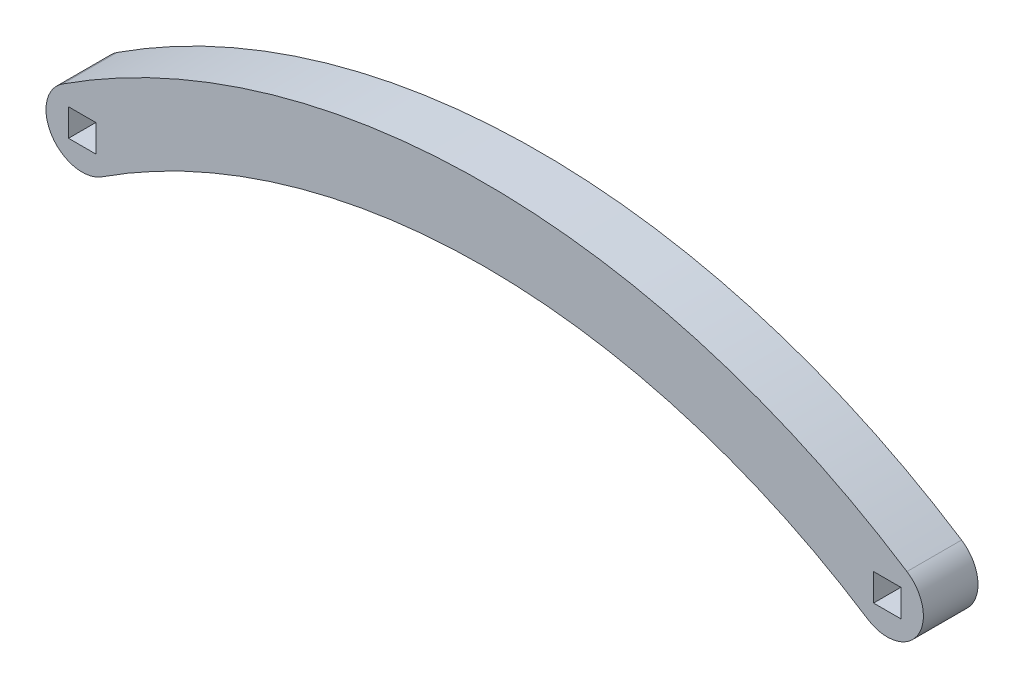
ISO-10303-21;
HEADER;
FILE_DESCRIPTION(('STEP AP214'),'2;1');
FILE_NAME('part.step','',(''),(''),'','','');
FILE_SCHEMA(('AUTOMOTIVE_DESIGN { 1 0 10303 214 1 1 1 1 }'));
ENDSEC;
DATA;
#1=APPLICATION_CONTEXT('core data for automotive mechanical design processes');
#2=APPLICATION_PROTOCOL_DEFINITION('international standard','automotive_design',2000,#1);
#3=PRODUCT_CONTEXT('',#1,'mechanical');
#4=PRODUCT('Part','Part','',(#3));
#5=PRODUCT_RELATED_PRODUCT_CATEGORY('part','',(#4));
#6=PRODUCT_DEFINITION_FORMATION('','',#4);
#7=PRODUCT_DEFINITION_CONTEXT('part definition',#1,'design');
#8=PRODUCT_DEFINITION('design','',#6,#7);
#9=PRODUCT_DEFINITION_SHAPE('','',#8);
#10=(LENGTH_UNIT() NAMED_UNIT(*) SI_UNIT(.MILLI.,.METRE.));
#11=(NAMED_UNIT(*) PLANE_ANGLE_UNIT() SI_UNIT($,.RADIAN.));
#12=(NAMED_UNIT(*) SI_UNIT($,.STERADIAN.) SOLID_ANGLE_UNIT());
#13=UNCERTAINTY_MEASURE_WITH_UNIT(LENGTH_MEASURE(1.E-05),#10,'distance_accuracy_value','');
#14=(GEOMETRIC_REPRESENTATION_CONTEXT(3) GLOBAL_UNCERTAINTY_ASSIGNED_CONTEXT((#13)) GLOBAL_UNIT_ASSIGNED_CONTEXT((#10,
#11,#12)) REPRESENTATION_CONTEXT('',''));
#15=CARTESIAN_POINT('',(0.,0.,0.));
#16=DIRECTION('',(0.,0.,1.));
#17=DIRECTION('',(1.,0.,0.));
#18=AXIS2_PLACEMENT_3D('',#15,#16,#17);
#19=CARTESIAN_POINT('',(70.19925,-35.952738452007,6.35));
#20=DIRECTION('',(0.,0.,1.));
#21=DIRECTION('',(1.,0.,0.));
#22=AXIS2_PLACEMENT_3D('',#19,#20,#21);
#23=PLANE('',#22);
#24=CARTESIAN_POINT('',(93.599,0.,6.35));
#25=DIRECTION('',(0.,0.,1.));
#26=DIRECTION('',(1.,0.,0.));
#27=AXIS2_PLACEMENT_3D('',#24,#25,#26);
#28=CIRCLE('',#27,4.20759868162931);
#29=CARTESIAN_POINT('',(91.3038071306281,-3.52646797206967,6.35));
#30=VERTEX_POINT('',#29);
#31=CARTESIAN_POINT('',(95.8941928693718,3.52646797206971,6.35));
#32=VERTEX_POINT('',#31);
#33=EDGE_CURVE('E220',#30,#32,#28,.T.);
#34=ORIENTED_EDGE('',*,*,#33,.T.);
#35=CARTESIAN_POINT('',(46.7995,-71.905476904014,6.35));
#36=DIRECTION('',(0.,0.,1.));
#37=DIRECTION('',(1.,0.,0.));
#38=AXIS2_PLACEMENT_3D('',#35,#36,#37);
#39=CIRCLE('',#38,90.0014842973519);
#40=CARTESIAN_POINT('',(-2.29519286937187,3.52646797206969,6.35));
#41=VERTEX_POINT('',#40);
#42=EDGE_CURVE('E224',#32,#41,#39,.T.);
#43=ORIENTED_EDGE('',*,*,#42,.T.);
#44=CARTESIAN_POINT('',(0.,0.,6.35));
#45=DIRECTION('',(0.,0.,1.));
#46=DIRECTION('',(1.,0.,0.));
#47=AXIS2_PLACEMENT_3D('',#44,#45,#46);
#48=CIRCLE('',#47,4.20759868162932);
#49=CARTESIAN_POINT('',(2.29519286937185,-3.52646797206968,6.35));
#50=VERTEX_POINT('',#49);
#51=EDGE_CURVE('E228',#41,#50,#48,.T.);
#52=ORIENTED_EDGE('',*,*,#51,.T.);
#53=CARTESIAN_POINT('',(46.7995,-71.905476904014,6.35));
#54=DIRECTION('',(0.,0.,-1.));
#55=DIRECTION('',(1.,0.,0.));
#56=AXIS2_PLACEMENT_3D('',#53,#54,#55);
#57=CIRCLE('',#56,81.5862869340933);
#58=EDGE_CURVE('E231',#50,#30,#57,.T.);
#59=ORIENTED_EDGE('',*,*,#58,.T.);
#60=EDGE_LOOP('',(#34,#43,#52,#59));
#61=FACE_BOUND('',#60,.T.);
#62=DIRECTION('',(-1.,0.,0.));
#63=VECTOR('',#62,1.);
#64=CARTESIAN_POINT('',(-1.5875,1.5875,6.35));
#65=LINE('',#64,#63);
#66=CARTESIAN_POINT('',(1.5875,1.5875,6.35));
#67=VERTEX_POINT('',#66);
#68=CARTESIAN_POINT('',(-1.5875,1.5875,6.35));
#69=VERTEX_POINT('',#68);
#70=EDGE_CURVE('E180',#67,#69,#65,.T.);
#71=ORIENTED_EDGE('',*,*,#70,.F.);
#72=DIRECTION('',(0.,1.,0.));
#73=VECTOR('',#72,1.);
#74=CARTESIAN_POINT('',(1.5875,-1.5875,6.35));
#75=LINE('',#74,#73);
#76=CARTESIAN_POINT('',(1.5875,-1.5875,6.35));
#77=VERTEX_POINT('',#76);
#78=EDGE_CURVE('E177',#77,#67,#75,.T.);
#79=ORIENTED_EDGE('',*,*,#78,.F.);
#80=DIRECTION('',(1.,0.,0.));
#81=VECTOR('',#80,1.);
#82=CARTESIAN_POINT('',(-1.5875,-1.5875,6.35));
#83=LINE('',#82,#81);
#84=CARTESIAN_POINT('',(-1.58749999999999,-1.5875,6.35));
#85=VERTEX_POINT('',#84);
#86=EDGE_CURVE('E188',#85,#77,#83,.T.);
#87=ORIENTED_EDGE('',*,*,#86,.F.);
#88=DIRECTION('',(0.,-1.,0.));
#89=VECTOR('',#88,1.);
#90=CARTESIAN_POINT('',(-1.5875,-1.5875,6.35));
#91=LINE('',#90,#89);
#92=EDGE_CURVE('E184',#69,#85,#91,.T.);
#93=ORIENTED_EDGE('',*,*,#92,.F.);
#94=EDGE_LOOP('',(#71,#79,#87,#93));
#95=FACE_BOUND('',#94,.T.);
#96=DIRECTION('',(-1.,0.,0.));
#97=VECTOR('',#96,1.);
#98=CARTESIAN_POINT('',(92.0115,1.58749999999999,6.35));
#99=LINE('',#98,#97);
#100=CARTESIAN_POINT('',(95.1865,1.5875,6.35));
#101=VERTEX_POINT('',#100);
#102=CARTESIAN_POINT('',(92.0115,1.58749999999999,6.35));
#103=VERTEX_POINT('',#102);
#104=EDGE_CURVE('E138',#101,#103,#99,.T.);
#105=ORIENTED_EDGE('',*,*,#104,.F.);
#106=DIRECTION('',(0.,1.,0.));
#107=VECTOR('',#106,1.);
#108=CARTESIAN_POINT('',(95.1865,-1.5875,6.35));
#109=LINE('',#108,#107);
#110=CARTESIAN_POINT('',(95.1865,-1.5875,6.35));
#111=VERTEX_POINT('',#110);
#112=EDGE_CURVE('E129',#111,#101,#109,.T.);
#113=ORIENTED_EDGE('',*,*,#112,.F.);
#114=DIRECTION('',(1.,0.,0.));
#115=VECTOR('',#114,1.);
#116=CARTESIAN_POINT('',(92.0115,-1.5875,6.35));
#117=LINE('',#116,#115);
#118=CARTESIAN_POINT('',(92.0115,-1.5875,6.35));
#119=VERTEX_POINT('',#118);
#120=EDGE_CURVE('E155',#119,#111,#117,.T.);
#121=ORIENTED_EDGE('',*,*,#120,.F.);
#122=DIRECTION('',(0.,-1.,0.));
#123=VECTOR('',#122,1.);
#124=CARTESIAN_POINT('',(92.0115,-1.5875,6.35));
#125=LINE('',#124,#123);
#126=EDGE_CURVE('E151',#103,#119,#125,.T.);
#127=ORIENTED_EDGE('',*,*,#126,.F.);
#128=EDGE_LOOP('',(#105,#113,#121,#127));
#129=FACE_BOUND('',#128,.T.);
#130=ADVANCED_FACE('F39',(#61,#95,#129),#23,.T.);
#131=CARTESIAN_POINT('',(70.19925,-35.952738452007,0.));
#132=DIRECTION('',(0.,0.,1.));
#133=DIRECTION('',(1.,0.,0.));
#134=AXIS2_PLACEMENT_3D('',#131,#132,#133);
#135=PLANE('',#134);
#136=DIRECTION('',(0.,1.,0.));
#137=VECTOR('',#136,1.);
#138=CARTESIAN_POINT('',(1.5875,-1.5875,0.));
#139=LINE('',#138,#137);
#140=CARTESIAN_POINT('',(1.58750000000001,-1.5875,0.));
#141=VERTEX_POINT('',#140);
#142=CARTESIAN_POINT('',(1.5875,1.5875,0.));
#143=VERTEX_POINT('',#142);
#144=EDGE_CURVE('E147',#141,#143,#139,.T.);
#145=ORIENTED_EDGE('',*,*,#144,.T.);
#146=DIRECTION('',(-1.,0.,0.));
#147=VECTOR('',#146,1.);
#148=CARTESIAN_POINT('',(-1.5875,1.5875,0.));
#149=LINE('',#148,#147);
#150=CARTESIAN_POINT('',(-1.5875,1.5875,0.));
#151=VERTEX_POINT('',#150);
#152=EDGE_CURVE('E195',#143,#151,#149,.T.);
#153=ORIENTED_EDGE('',*,*,#152,.T.);
#154=DIRECTION('',(0.,-1.,0.));
#155=VECTOR('',#154,1.);
#156=CARTESIAN_POINT('',(-1.5875,-1.5875,0.));
#157=LINE('',#156,#155);
#158=CARTESIAN_POINT('',(-1.5875,-1.5875,0.));
#159=VERTEX_POINT('',#158);
#160=EDGE_CURVE('E199',#151,#159,#157,.T.);
#161=ORIENTED_EDGE('',*,*,#160,.T.);
#162=DIRECTION('',(1.,0.,0.));
#163=VECTOR('',#162,1.);
#164=CARTESIAN_POINT('',(-1.5875,-1.5875,0.));
#165=LINE('',#164,#163);
#166=EDGE_CURVE('E181',#159,#141,#165,.T.);
#167=ORIENTED_EDGE('',*,*,#166,.T.);
#168=EDGE_LOOP('',(#145,#153,#161,#167));
#169=FACE_BOUND('',#168,.T.);
#170=CARTESIAN_POINT('',(93.599,0.,0.));
#171=DIRECTION('',(0.,0.,1.));
#172=DIRECTION('',(1.,0.,0.));
#173=AXIS2_PLACEMENT_3D('',#170,#171,#172);
#174=CIRCLE('',#173,4.20759868162931);
#175=CARTESIAN_POINT('',(91.3038071306281,-3.52646797206967,0.));
#176=VERTEX_POINT('',#175);
#177=CARTESIAN_POINT('',(95.8941928693718,3.52646797206971,0.));
#178=VERTEX_POINT('',#177);
#179=EDGE_CURVE('E219',#176,#178,#174,.T.);
#180=ORIENTED_EDGE('',*,*,#179,.F.);
#181=CARTESIAN_POINT('',(46.7995,-71.905476904014,0.));
#182=DIRECTION('',(0.,0.,-1.));
#183=DIRECTION('',(1.,0.,0.));
#184=AXIS2_PLACEMENT_3D('',#181,#182,#183);
#185=CIRCLE('',#184,81.5862869340933);
#186=CARTESIAN_POINT('',(2.29519286937185,-3.52646797206968,0.));
#187=VERTEX_POINT('',#186);
#188=EDGE_CURVE('E225',#187,#176,#185,.T.);
#189=ORIENTED_EDGE('',*,*,#188,.F.);
#190=CARTESIAN_POINT('',(0.,0.,0.));
#191=DIRECTION('',(0.,0.,1.));
#192=DIRECTION('',(1.,0.,0.));
#193=AXIS2_PLACEMENT_3D('',#190,#191,#192);
#194=CIRCLE('',#193,4.20759868162932);
#195=CARTESIAN_POINT('',(-2.29519286937187,3.52646797206969,0.));
#196=VERTEX_POINT('',#195);
#197=EDGE_CURVE('E241',#196,#187,#194,.T.);
#198=ORIENTED_EDGE('',*,*,#197,.F.);
#199=CARTESIAN_POINT('',(46.7995,-71.905476904014,0.));
#200=DIRECTION('',(0.,0.,1.));
#201=DIRECTION('',(1.,0.,0.));
#202=AXIS2_PLACEMENT_3D('',#199,#200,#201);
#203=CIRCLE('',#202,90.0014842973519);
#204=EDGE_CURVE('E238',#178,#196,#203,.T.);
#205=ORIENTED_EDGE('',*,*,#204,.F.);
#206=EDGE_LOOP('',(#180,#189,#198,#205));
#207=FACE_BOUND('',#206,.T.);
#208=DIRECTION('',(0.,1.,0.));
#209=VECTOR('',#208,1.);
#210=CARTESIAN_POINT('',(95.1865,-1.5875,0.));
#211=LINE('',#210,#209);
#212=CARTESIAN_POINT('',(95.1865,-1.5875,0.));
#213=VERTEX_POINT('',#212);
#214=CARTESIAN_POINT('',(95.1865,1.5875,0.));
#215=VERTEX_POINT('',#214);
#216=EDGE_CURVE('E63',#213,#215,#211,.T.);
#217=ORIENTED_EDGE('',*,*,#216,.T.);
#218=DIRECTION('',(-1.,0.,0.));
#219=VECTOR('',#218,1.);
#220=CARTESIAN_POINT('',(92.0115,1.58749999999999,0.));
#221=LINE('',#220,#219);
#222=CARTESIAN_POINT('',(92.0115,1.58749999999999,0.));
#223=VERTEX_POINT('',#222);
#224=EDGE_CURVE('E145',#215,#223,#221,.T.);
#225=ORIENTED_EDGE('',*,*,#224,.T.);
#226=DIRECTION('',(0.,-1.,0.));
#227=VECTOR('',#226,1.);
#228=CARTESIAN_POINT('',(92.0115,-1.5875,0.));
#229=LINE('',#228,#227);
#230=CARTESIAN_POINT('',(92.0115,-1.5875,0.));
#231=VERTEX_POINT('',#230);
#232=EDGE_CURVE('E164',#223,#231,#229,.T.);
#233=ORIENTED_EDGE('',*,*,#232,.T.);
#234=DIRECTION('',(1.,0.,0.));
#235=VECTOR('',#234,1.);
#236=CARTESIAN_POINT('',(92.0115,-1.5875,0.));
#237=LINE('',#236,#235);
#238=EDGE_CURVE('E139',#231,#213,#237,.T.);
#239=ORIENTED_EDGE('',*,*,#238,.T.);
#240=EDGE_LOOP('',(#217,#225,#233,#239));
#241=FACE_BOUND('',#240,.T.);
#242=ADVANCED_FACE('F264',(#169,#207,#241),#135,.F.);
#243=CARTESIAN_POINT('',(93.599,0.,6.35));
#244=DIRECTION('',(0.,0.,-1.));
#245=DIRECTION('',(-1.,0.,0.));
#246=AXIS2_PLACEMENT_3D('',#243,#244,#245);
#247=CYLINDRICAL_SURFACE('',#246,4.20759868162931);
#248=ORIENTED_EDGE('',*,*,#179,.T.);
#249=DIRECTION('',(0.,0.,-1.));
#250=VECTOR('',#249,1.);
#251=CARTESIAN_POINT('',(95.8941928693718,3.52646797206971,6.35));
#252=LINE('',#251,#250);
#253=EDGE_CURVE('E11',#32,#178,#252,.T.);
#254=ORIENTED_EDGE('',*,*,#253,.F.);
#255=ORIENTED_EDGE('',*,*,#33,.F.);
#256=DIRECTION('',(0.,0.,-1.));
#257=VECTOR('',#256,1.);
#258=CARTESIAN_POINT('',(91.3038071306281,-3.52646797206967,6.35));
#259=LINE('',#258,#257);
#260=EDGE_CURVE('E234',#30,#176,#259,.T.);
#261=ORIENTED_EDGE('',*,*,#260,.T.);
#262=EDGE_LOOP('',(#248,#254,#255,#261));
#263=FACE_BOUND('',#262,.T.);
#264=ADVANCED_FACE('F41',(#263),#247,.T.);
#265=CARTESIAN_POINT('',(46.7995,-71.905476904014,6.35));
#266=DIRECTION('',(0.,0.,-1.));
#267=DIRECTION('',(-1.,0.,0.));
#268=AXIS2_PLACEMENT_3D('',#265,#266,#267);
#269=CYLINDRICAL_SURFACE('',#268,90.0014842973519);
#270=ORIENTED_EDGE('',*,*,#204,.T.);
#271=DIRECTION('',(0.,0.,-1.));
#272=VECTOR('',#271,1.);
#273=CARTESIAN_POINT('',(-2.29519286937187,3.52646797206969,6.35));
#274=LINE('',#273,#272);
#275=EDGE_CURVE('E48',#41,#196,#274,.T.);
#276=ORIENTED_EDGE('',*,*,#275,.F.);
#277=ORIENTED_EDGE('',*,*,#42,.F.);
#278=ORIENTED_EDGE('',*,*,#253,.T.);
#279=EDGE_LOOP('',(#270,#276,#277,#278));
#280=FACE_BOUND('',#279,.T.);
#281=ADVANCED_FACE('F275',(#280),#269,.T.);
#282=CARTESIAN_POINT('',(0.,0.,6.35));
#283=DIRECTION('',(0.,0.,-1.));
#284=DIRECTION('',(-1.,0.,0.));
#285=AXIS2_PLACEMENT_3D('',#282,#283,#284);
#286=CYLINDRICAL_SURFACE('',#285,4.20759868162932);
#287=ORIENTED_EDGE('',*,*,#197,.T.);
#288=DIRECTION('',(0.,0.,-1.));
#289=VECTOR('',#288,1.);
#290=CARTESIAN_POINT('',(2.29519286937185,-3.52646797206968,6.35));
#291=LINE('',#290,#289);
#292=EDGE_CURVE('E249',#50,#187,#291,.T.);
#293=ORIENTED_EDGE('',*,*,#292,.F.);
#294=ORIENTED_EDGE('',*,*,#51,.F.);
#295=ORIENTED_EDGE('',*,*,#275,.T.);
#296=EDGE_LOOP('',(#287,#293,#294,#295));
#297=FACE_BOUND('',#296,.T.);
#298=ADVANCED_FACE('F258',(#297),#286,.T.);
#299=CARTESIAN_POINT('',(46.7995,-71.905476904014,6.35));
#300=DIRECTION('',(0.,0.,-1.));
#301=DIRECTION('',(-1.,0.,0.));
#302=AXIS2_PLACEMENT_3D('',#299,#300,#301);
#303=CYLINDRICAL_SURFACE('',#302,81.5862869340933);
#304=ORIENTED_EDGE('',*,*,#188,.T.);
#305=ORIENTED_EDGE('',*,*,#260,.F.);
#306=ORIENTED_EDGE('',*,*,#58,.F.);
#307=ORIENTED_EDGE('',*,*,#292,.T.);
#308=EDGE_LOOP('',(#304,#305,#306,#307));
#309=FACE_BOUND('',#308,.T.);
#310=ADVANCED_FACE('F268',(#309),#303,.F.);
#311=CARTESIAN_POINT('',(1.5875,-1.5875,6.35));
#312=DIRECTION('',(-1.,0.,0.));
#313=DIRECTION('',(0.,0.,1.));
#314=AXIS2_PLACEMENT_3D('',#311,#312,#313);
#315=PLANE('',#314);
#316=ORIENTED_EDGE('',*,*,#144,.F.);
#317=DIRECTION('',(0.,0.,-1.));
#318=VECTOR('',#317,1.);
#319=CARTESIAN_POINT('',(1.5875,-1.5875,6.35));
#320=LINE('',#319,#318);
#321=EDGE_CURVE('E191',#77,#141,#320,.T.);
#322=ORIENTED_EDGE('',*,*,#321,.F.);
#323=ORIENTED_EDGE('',*,*,#78,.T.);
#324=DIRECTION('',(0.,0.,-1.));
#325=VECTOR('',#324,1.);
#326=CARTESIAN_POINT('',(1.5875,1.5875,6.35));
#327=LINE('',#326,#325);
#328=EDGE_CURVE('E215',#67,#143,#327,.T.);
#329=ORIENTED_EDGE('',*,*,#328,.T.);
#330=EDGE_LOOP('',(#316,#322,#323,#329));
#331=FACE_BOUND('',#330,.T.);
#332=ADVANCED_FACE('F290',(#331),#315,.T.);
#333=CARTESIAN_POINT('',(-1.5875,1.5875,6.35));
#334=DIRECTION('',(0.,-1.,0.));
#335=DIRECTION('',(0.,0.,-1.));
#336=AXIS2_PLACEMENT_3D('',#333,#334,#335);
#337=PLANE('',#336);
#338=ORIENTED_EDGE('',*,*,#152,.F.);
#339=ORIENTED_EDGE('',*,*,#328,.F.);
#340=ORIENTED_EDGE('',*,*,#70,.T.);
#341=DIRECTION('',(0.,0.,-1.));
#342=VECTOR('',#341,1.);
#343=CARTESIAN_POINT('',(-1.5875,1.5875,6.35));
#344=LINE('',#343,#342);
#345=EDGE_CURVE('E212',#69,#151,#344,.T.);
#346=ORIENTED_EDGE('',*,*,#345,.T.);
#347=EDGE_LOOP('',(#338,#339,#340,#346));
#348=FACE_BOUND('',#347,.T.);
#349=ADVANCED_FACE('F297',(#348),#337,.T.);
#350=CARTESIAN_POINT('',(-1.5875,-1.5875,6.35));
#351=DIRECTION('',(1.,0.,0.));
#352=DIRECTION('',(0.,0.,-1.));
#353=AXIS2_PLACEMENT_3D('',#350,#351,#352);
#354=PLANE('',#353);
#355=ORIENTED_EDGE('',*,*,#160,.F.);
#356=ORIENTED_EDGE('',*,*,#345,.F.);
#357=ORIENTED_EDGE('',*,*,#92,.T.);
#358=DIRECTION('',(0.,0.,-1.));
#359=VECTOR('',#358,1.);
#360=CARTESIAN_POINT('',(-1.5875,-1.5875,6.35));
#361=LINE('',#360,#359);
#362=EDGE_CURVE('E209',#85,#159,#361,.T.);
#363=ORIENTED_EDGE('',*,*,#362,.T.);
#364=EDGE_LOOP('',(#355,#356,#357,#363));
#365=FACE_BOUND('',#364,.T.);
#366=ADVANCED_FACE('F302',(#365),#354,.T.);
#367=CARTESIAN_POINT('',(-1.5875,-1.5875,6.35));
#368=DIRECTION('',(0.,1.,0.));
#369=DIRECTION('',(0.,0.,1.));
#370=AXIS2_PLACEMENT_3D('',#367,#368,#369);
#371=PLANE('',#370);
#372=ORIENTED_EDGE('',*,*,#166,.F.);
#373=ORIENTED_EDGE('',*,*,#362,.F.);
#374=ORIENTED_EDGE('',*,*,#86,.T.);
#375=ORIENTED_EDGE('',*,*,#321,.T.);
#376=EDGE_LOOP('',(#372,#373,#374,#375));
#377=FACE_BOUND('',#376,.T.);
#378=ADVANCED_FACE('F309',(#377),#371,.T.);
#379=CARTESIAN_POINT('',(95.1865,-1.5875,6.35));
#380=DIRECTION('',(-1.,0.,0.));
#381=DIRECTION('',(0.,0.,1.));
#382=AXIS2_PLACEMENT_3D('',#379,#380,#381);
#383=PLANE('',#382);
#384=ORIENTED_EDGE('',*,*,#216,.F.);
#385=DIRECTION('',(0.,0.,-1.));
#386=VECTOR('',#385,1.);
#387=CARTESIAN_POINT('',(95.1865,-1.5875,6.35));
#388=LINE('',#387,#386);
#389=EDGE_CURVE('E133',#111,#213,#388,.T.);
#390=ORIENTED_EDGE('',*,*,#389,.F.);
#391=ORIENTED_EDGE('',*,*,#112,.T.);
#392=DIRECTION('',(0.,0.,-1.));
#393=VECTOR('',#392,1.);
#394=CARTESIAN_POINT('',(95.1865,1.5875,6.35));
#395=LINE('',#394,#393);
#396=EDGE_CURVE('E132',#101,#215,#395,.T.);
#397=ORIENTED_EDGE('',*,*,#396,.T.);
#398=EDGE_LOOP('',(#384,#390,#391,#397));
#399=FACE_BOUND('',#398,.T.);
#400=ADVANCED_FACE('F131',(#399),#383,.T.);
#401=CARTESIAN_POINT('',(92.0115,1.58749999999999,6.35));
#402=DIRECTION('',(0.,-1.,0.));
#403=DIRECTION('',(1.,0.,0.));
#404=AXIS2_PLACEMENT_3D('',#401,#402,#403);
#405=PLANE('',#404);
#406=ORIENTED_EDGE('',*,*,#224,.F.);
#407=ORIENTED_EDGE('',*,*,#396,.F.);
#408=ORIENTED_EDGE('',*,*,#104,.T.);
#409=DIRECTION('',(0.,0.,-1.));
#410=VECTOR('',#409,1.);
#411=CARTESIAN_POINT('',(92.0115,1.58749999999999,6.35));
#412=LINE('',#411,#410);
#413=EDGE_CURVE('E148',#103,#223,#412,.T.);
#414=ORIENTED_EDGE('',*,*,#413,.T.);
#415=EDGE_LOOP('',(#406,#407,#408,#414));
#416=FACE_BOUND('',#415,.T.);
#417=ADVANCED_FACE('F142',(#416),#405,.T.);
#418=CARTESIAN_POINT('',(92.0115,-1.5875,6.35));
#419=DIRECTION('',(1.,0.,0.));
#420=DIRECTION('',(0.,0.,-1.));
#421=AXIS2_PLACEMENT_3D('',#418,#419,#420);
#422=PLANE('',#421);
#423=ORIENTED_EDGE('',*,*,#232,.F.);
#424=ORIENTED_EDGE('',*,*,#413,.F.);
#425=ORIENTED_EDGE('',*,*,#126,.T.);
#426=DIRECTION('',(0.,0.,-1.));
#427=VECTOR('',#426,1.);
#428=CARTESIAN_POINT('',(92.0115,-1.5875,6.35));
#429=LINE('',#428,#427);
#430=EDGE_CURVE('E55',#119,#231,#429,.T.);
#431=ORIENTED_EDGE('',*,*,#430,.T.);
#432=EDGE_LOOP('',(#423,#424,#425,#431));
#433=FACE_BOUND('',#432,.T.);
#434=ADVANCED_FACE('F327',(#433),#422,.T.);
#435=CARTESIAN_POINT('',(92.0115,-1.5875,6.35));
#436=DIRECTION('',(0.,1.,0.));
#437=DIRECTION('',(0.,0.,1.));
#438=AXIS2_PLACEMENT_3D('',#435,#436,#437);
#439=PLANE('',#438);
#440=ORIENTED_EDGE('',*,*,#238,.F.);
#441=ORIENTED_EDGE('',*,*,#430,.F.);
#442=ORIENTED_EDGE('',*,*,#120,.T.);
#443=ORIENTED_EDGE('',*,*,#389,.T.);
#444=EDGE_LOOP('',(#440,#441,#442,#443));
#445=FACE_BOUND('',#444,.T.);
#446=ADVANCED_FACE('F330',(#445),#439,.T.);
#447=CLOSED_SHELL('',(#130,#242,#264,#281,#298,#310,#332,#349,#366,#378,#400,#417,#434,#446));
#448=MANIFOLD_SOLID_BREP('B2',#447);
#449=ADVANCED_BREP_SHAPE_REPRESENTATION('',(#18,#448),#14);
#450=SHAPE_DEFINITION_REPRESENTATION(#9,#449);
ENDSEC;
END-ISO-10303-21;
